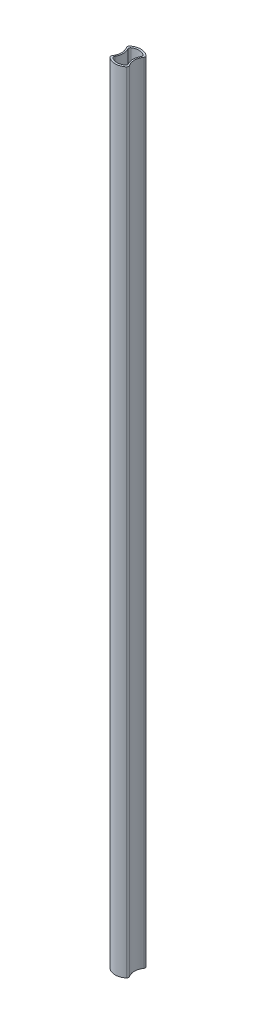
ISO-10303-21;
HEADER;
FILE_DESCRIPTION(('STEP AP214'),'2;1');
FILE_NAME('part.step','',(''),(''),'','','');
FILE_SCHEMA(('AUTOMOTIVE_DESIGN { 1 0 10303 214 1 1 1 1 }'));
ENDSEC;
DATA;
#1=APPLICATION_CONTEXT('core data for automotive mechanical design processes');
#2=APPLICATION_PROTOCOL_DEFINITION('international standard','automotive_design',2000,#1);
#3=PRODUCT_CONTEXT('',#1,'mechanical');
#4=PRODUCT('Part','Part','',(#3));
#5=PRODUCT_RELATED_PRODUCT_CATEGORY('part','',(#4));
#6=PRODUCT_DEFINITION_FORMATION('','',#4);
#7=PRODUCT_DEFINITION_CONTEXT('part definition',#1,'design');
#8=PRODUCT_DEFINITION('design','',#6,#7);
#9=PRODUCT_DEFINITION_SHAPE('','',#8);
#10=(LENGTH_UNIT() NAMED_UNIT(*) SI_UNIT(.MILLI.,.METRE.));
#11=(NAMED_UNIT(*) PLANE_ANGLE_UNIT() SI_UNIT($,.RADIAN.));
#12=(NAMED_UNIT(*) SI_UNIT($,.STERADIAN.) SOLID_ANGLE_UNIT());
#13=UNCERTAINTY_MEASURE_WITH_UNIT(LENGTH_MEASURE(1.E-05),#10,'distance_accuracy_value','');
#14=(GEOMETRIC_REPRESENTATION_CONTEXT(3) GLOBAL_UNCERTAINTY_ASSIGNED_CONTEXT((#13)) GLOBAL_UNIT_ASSIGNED_CONTEXT((#10,
#11,#12)) REPRESENTATION_CONTEXT('',''));
#15=CARTESIAN_POINT('',(0.,0.,0.));
#16=DIRECTION('',(0.,0.,1.));
#17=DIRECTION('',(1.,0.,0.));
#18=AXIS2_PLACEMENT_3D('',#15,#16,#17);
#19=CARTESIAN_POINT('',(-6.64583333333331,400.,2.10396038592809));
#20=DIRECTION('',(0.,-1.,0.));
#21=DIRECTION('',(0.,0.,-1.));
#22=AXIS2_PLACEMENT_3D('',#19,#20,#21);
#23=PLANE('',#22);
#24=CARTESIAN_POINT('',(-3.5416666666666,400.,4.20792077185641));
#25=DIRECTION('',(0.,1.,0.));
#26=DIRECTION('',(0.,0.,-1.));
#27=AXIS2_PLACEMENT_3D('',#24,#25,#26);
#28=CIRCLE('',#27,1.);
#29=CARTESIAN_POINT('',(-4.36944444444442,400.,3.64686466894221));
#30=VERTEX_POINT('',#29);
#31=CARTESIAN_POINT('',(-4.18560606060607,400.,4.97299727583033));
#32=VERTEX_POINT('',#31);
#33=EDGE_CURVE('E224',#30,#32,#28,.T.);
#34=ORIENTED_EDGE('',*,*,#33,.T.);
#35=CARTESIAN_POINT('',(0.,400.,-1.97758476261356E-13));
#36=DIRECTION('',(0.,1.,0.));
#37=DIRECTION('',(0.,0.,1.));
#38=AXIS2_PLACEMENT_3D('',#35,#36,#37);
#39=CIRCLE('',#38,6.5);
#40=CARTESIAN_POINT('',(4.18560606060611,400.,4.97299727583037));
#41=VERTEX_POINT('',#40);
#42=EDGE_CURVE('E227',#32,#41,#39,.T.);
#43=ORIENTED_EDGE('',*,*,#42,.T.);
#44=CARTESIAN_POINT('',(3.54166666666667,400.,4.20792077185641));
#45=DIRECTION('',(0.,1.,0.));
#46=DIRECTION('',(0.,0.,-1.));
#47=AXIS2_PLACEMENT_3D('',#44,#45,#46);
#48=CIRCLE('',#47,1.);
#49=CARTESIAN_POINT('',(4.36944444444448,400.,3.6468646689422));
#50=VERTEX_POINT('',#49);
#51=EDGE_CURVE('E230',#41,#50,#48,.T.);
#52=ORIENTED_EDGE('',*,*,#51,.T.);
#53=CARTESIAN_POINT('',(9.75000000000006,400.,-2.32452945780892E-13));
#54=DIRECTION('',(0.,-1.,0.));
#55=DIRECTION('',(0.,0.,1.));
#56=AXIS2_PLACEMENT_3D('',#53,#54,#55);
#57=CIRCLE('',#56,6.5);
#58=CARTESIAN_POINT('',(4.36944444444447,400.,-3.64686466894257));
#59=VERTEX_POINT('',#58);
#60=EDGE_CURVE('E232',#50,#59,#57,.T.);
#61=ORIENTED_EDGE('',*,*,#60,.T.);
#62=CARTESIAN_POINT('',(3.54166666666667,400.,-4.20792077185679));
#63=DIRECTION('',(0.,1.,0.));
#64=DIRECTION('',(0.,0.,1.));
#65=AXIS2_PLACEMENT_3D('',#62,#63,#64);
#66=CIRCLE('',#65,1.);
#67=CARTESIAN_POINT('',(4.18560606060608,400.,-4.9729972758307));
#68=VERTEX_POINT('',#67);
#69=EDGE_CURVE('E234',#59,#68,#66,.T.);
#70=ORIENTED_EDGE('',*,*,#69,.T.);
#71=CARTESIAN_POINT('',(0.,400.,-1.97758476261356E-13));
#72=DIRECTION('',(0.,1.,0.));
#73=DIRECTION('',(0.,0.,1.));
#74=AXIS2_PLACEMENT_3D('',#71,#72,#73);
#75=CIRCLE('',#74,6.5);
#76=CARTESIAN_POINT('',(-4.18560606060604,400.,-4.97299727583073));
#77=VERTEX_POINT('',#76);
#78=EDGE_CURVE('E236',#68,#77,#75,.T.);
#79=ORIENTED_EDGE('',*,*,#78,.T.);
#80=CARTESIAN_POINT('',(-3.54166666666664,400.,-4.20792077185677));
#81=DIRECTION('',(0.,1.,0.));
#82=DIRECTION('',(0.,0.,1.));
#83=AXIS2_PLACEMENT_3D('',#80,#81,#82);
#84=CIRCLE('',#83,1.);
#85=CARTESIAN_POINT('',(-4.36944444444442,400.,-3.64686466894259));
#86=VERTEX_POINT('',#85);
#87=EDGE_CURVE('E238',#77,#86,#84,.T.);
#88=ORIENTED_EDGE('',*,*,#87,.T.);
#89=CARTESIAN_POINT('',(-9.74999999999992,400.,-2.22044604925031E-13));
#90=DIRECTION('',(0.,-1.,0.));
#91=DIRECTION('',(0.,0.,1.));
#92=AXIS2_PLACEMENT_3D('',#89,#90,#91);
#93=CIRCLE('',#92,6.5);
#94=EDGE_CURVE('E240',#86,#30,#93,.T.);
#95=ORIENTED_EDGE('',*,*,#94,.T.);
#96=EDGE_LOOP('',(#34,#43,#52,#61,#70,#79,#88,#95));
#97=FACE_BOUND('',#96,.T.);
#98=CARTESIAN_POINT('',(-2.49999999999996,400.,-3.74165738677411));
#99=DIRECTION('',(0.,1.,0.));
#100=DIRECTION('',(0.,0.,-1.));
#101=AXIS2_PLACEMENT_3D('',#98,#99,#100);
#102=CIRCLE('',#101,1.);
#103=CARTESIAN_POINT('',(-3.05555555555555,400.,-4.57313680605723));
#104=VERTEX_POINT('',#103);
#105=CARTESIAN_POINT('',(-3.36666666666662,400.,-3.24276973520428));
#106=VERTEX_POINT('',#105);
#107=EDGE_CURVE('E159',#104,#106,#102,.T.);
#108=ORIENTED_EDGE('',*,*,#107,.F.);
#109=CARTESIAN_POINT('',(0.,400.,-1.97758476261356E-13));
#110=DIRECTION('',(0.,1.,0.));
#111=DIRECTION('',(0.,0.,1.));
#112=AXIS2_PLACEMENT_3D('',#109,#110,#111);
#113=CIRCLE('',#112,5.5);
#114=CARTESIAN_POINT('',(3.05555555555558,400.,-4.57313680605722));
#115=VERTEX_POINT('',#114);
#116=EDGE_CURVE('E192',#115,#104,#113,.T.);
#117=ORIENTED_EDGE('',*,*,#116,.F.);
#118=CARTESIAN_POINT('',(2.50000000000006,400.,-3.74165738677418));
#119=DIRECTION('',(0.,1.,0.));
#120=DIRECTION('',(0.,0.,-1.));
#121=AXIS2_PLACEMENT_3D('',#118,#119,#120);
#122=CIRCLE('',#121,1.);
#123=CARTESIAN_POINT('',(3.36666666666668,400.000000000001,-3.24276973520425));
#124=VERTEX_POINT('',#123);
#125=EDGE_CURVE('E190',#124,#115,#122,.T.);
#126=ORIENTED_EDGE('',*,*,#125,.F.);
#127=CARTESIAN_POINT('',(9.00000000000005,400.,-1.73472347597681E-13));
#128=DIRECTION('',(0.,-1.,0.));
#129=DIRECTION('',(0.,0.,1.));
#130=AXIS2_PLACEMENT_3D('',#127,#128,#129);
#131=CIRCLE('',#130,6.5);
#132=CARTESIAN_POINT('',(3.36666666666675,400.,3.24276973520387));
#133=VERTEX_POINT('',#132);
#134=EDGE_CURVE('E188',#133,#124,#131,.T.);
#135=ORIENTED_EDGE('',*,*,#134,.F.);
#136=CARTESIAN_POINT('',(2.50000000000002,400.,3.74165738677378));
#137=DIRECTION('',(0.,1.,0.));
#138=DIRECTION('',(0.,0.,-1.));
#139=AXIS2_PLACEMENT_3D('',#136,#137,#138);
#140=CIRCLE('',#139,1.);
#141=CARTESIAN_POINT('',(3.05555555555559,400.,4.57313680605683));
#142=VERTEX_POINT('',#141);
#143=EDGE_CURVE('E186',#142,#133,#140,.T.);
#144=ORIENTED_EDGE('',*,*,#143,.F.);
#145=CARTESIAN_POINT('',(0.,400.,-1.97758476261356E-13));
#146=DIRECTION('',(0.,1.,0.));
#147=DIRECTION('',(0.,0.,1.));
#148=AXIS2_PLACEMENT_3D('',#145,#146,#147);
#149=CIRCLE('',#148,5.5);
#150=CARTESIAN_POINT('',(-3.05555555555553,400.,4.57313680605684));
#151=VERTEX_POINT('',#150);
#152=EDGE_CURVE('E182',#151,#142,#149,.T.);
#153=ORIENTED_EDGE('',*,*,#152,.F.);
#154=CARTESIAN_POINT('',(-2.49999999999999,400.,3.74165738677376));
#155=DIRECTION('',(0.,1.,0.));
#156=DIRECTION('',(0.,0.,1.));
#157=AXIS2_PLACEMENT_3D('',#154,#155,#156);
#158=CIRCLE('',#157,1.);
#159=CARTESIAN_POINT('',(-3.3666666666666,400.,3.24276973520386));
#160=VERTEX_POINT('',#159);
#161=EDGE_CURVE('E180',#160,#151,#158,.T.);
#162=ORIENTED_EDGE('',*,*,#161,.F.);
#163=CARTESIAN_POINT('',(-8.99999999999993,400.,-1.94289029309402E-13));
#164=DIRECTION('',(0.,-1.,0.));
#165=DIRECTION('',(0.,0.,1.));
#166=AXIS2_PLACEMENT_3D('',#163,#164,#165);
#167=CIRCLE('',#166,6.5);
#168=EDGE_CURVE('E167',#106,#160,#167,.T.);
#169=ORIENTED_EDGE('',*,*,#168,.F.);
#170=EDGE_LOOP('',(#108,#117,#126,#135,#144,#153,#162,#169));
#171=FACE_BOUND('',#170,.T.);
#172=ADVANCED_FACE('F46',(#97,#171),#23,.F.);
#173=CARTESIAN_POINT('',(-6.64583333333334,3.33066907387547E-13,2.10396038592828));
#174=DIRECTION('',(0.,-1.,0.));
#175=DIRECTION('',(0.,0.,-1.));
#176=AXIS2_PLACEMENT_3D('',#173,#174,#175);
#177=PLANE('',#176);
#178=CARTESIAN_POINT('',(-3.54166666666673,1.11022302462516E-13,4.20792077185658));
#179=DIRECTION('',(0.,1.,0.));
#180=DIRECTION('',(0.,0.,-1.));
#181=AXIS2_PLACEMENT_3D('',#178,#179,#180);
#182=CIRCLE('',#181,1.);
#183=CARTESIAN_POINT('',(-4.36944444444444,5.55111512312578E-13,3.64686466894239));
#184=VERTEX_POINT('',#183);
#185=CARTESIAN_POINT('',(-4.18560606060608,1.11022302462516E-13,4.9729972758305));
#186=VERTEX_POINT('',#185);
#187=EDGE_CURVE('E175',#184,#186,#182,.T.);
#188=ORIENTED_EDGE('',*,*,#187,.F.);
#189=CARTESIAN_POINT('',(-9.75000000000007,1.11022302462516E-13,0.));
#190=DIRECTION('',(0.,-1.,0.));
#191=DIRECTION('',(0.,0.,1.));
#192=AXIS2_PLACEMENT_3D('',#189,#190,#191);
#193=CIRCLE('',#192,6.5);
#194=CARTESIAN_POINT('',(-4.3694444444445,2.22044604925031E-13,-3.64686466894243));
#195=VERTEX_POINT('',#194);
#196=EDGE_CURVE('E228',#195,#184,#193,.T.);
#197=ORIENTED_EDGE('',*,*,#196,.F.);
#198=CARTESIAN_POINT('',(-3.54166666666669,3.33066907387547E-13,-4.2079207718566));
#199=DIRECTION('',(0.,1.,0.));
#200=DIRECTION('',(0.,0.,1.));
#201=AXIS2_PLACEMENT_3D('',#198,#199,#200);
#202=CIRCLE('',#201,1.);
#203=CARTESIAN_POINT('',(-4.1856060606061,-1.11022302462516E-13,-4.97299727583057));
#204=VERTEX_POINT('',#203);
#205=EDGE_CURVE('E255',#204,#195,#202,.T.);
#206=ORIENTED_EDGE('',*,*,#205,.F.);
#207=CARTESIAN_POINT('',(0.,0.,0.));
#208=DIRECTION('',(0.,1.,0.));
#209=DIRECTION('',(0.,0.,1.));
#210=AXIS2_PLACEMENT_3D('',#207,#208,#209);
#211=CIRCLE('',#210,6.5);
#212=CARTESIAN_POINT('',(4.18560606060603,2.22044604925031E-13,-4.97299727583055));
#213=VERTEX_POINT('',#212);
#214=EDGE_CURVE('E253',#213,#204,#211,.T.);
#215=ORIENTED_EDGE('',*,*,#214,.F.);
#216=CARTESIAN_POINT('',(3.54166666666664,3.33066907387547E-13,-4.20792077185661));
#217=DIRECTION('',(0.,1.,0.));
#218=DIRECTION('',(0.,0.,1.));
#219=AXIS2_PLACEMENT_3D('',#216,#217,#218);
#220=CIRCLE('',#219,1.);
#221=CARTESIAN_POINT('',(4.36944444444443,3.33066907387547E-13,-3.64686466894237));
#222=VERTEX_POINT('',#221);
#223=EDGE_CURVE('E251',#222,#213,#220,.T.);
#224=ORIENTED_EDGE('',*,*,#223,.F.);
#225=CARTESIAN_POINT('',(9.75000000000002,0.,0.));
#226=DIRECTION('',(0.,-1.,0.));
#227=DIRECTION('',(0.,0.,1.));
#228=AXIS2_PLACEMENT_3D('',#225,#226,#227);
#229=CIRCLE('',#228,6.5);
#230=CARTESIAN_POINT('',(4.36944444444445,2.22044604925031E-13,3.64686466894233));
#231=VERTEX_POINT('',#230);
#232=EDGE_CURVE('E249',#231,#222,#229,.T.);
#233=ORIENTED_EDGE('',*,*,#232,.F.);
#234=CARTESIAN_POINT('',(3.54166666666666,1.11022302462516E-13,4.20792077185658));
#235=DIRECTION('',(0.,1.,0.));
#236=DIRECTION('',(0.,0.,-1.));
#237=AXIS2_PLACEMENT_3D('',#234,#235,#236);
#238=CIRCLE('',#237,1.);
#239=CARTESIAN_POINT('',(4.18560606060605,1.11022302462516E-13,4.97299727583053));
#240=VERTEX_POINT('',#239);
#241=EDGE_CURVE('E247',#240,#231,#238,.T.);
#242=ORIENTED_EDGE('',*,*,#241,.F.);
#243=CARTESIAN_POINT('',(0.,0.,0.));
#244=DIRECTION('',(0.,1.,0.));
#245=DIRECTION('',(0.,0.,1.));
#246=AXIS2_PLACEMENT_3D('',#243,#244,#245);
#247=CIRCLE('',#246,6.5);
#248=EDGE_CURVE('E245',#186,#240,#247,.T.);
#249=ORIENTED_EDGE('',*,*,#248,.F.);
#250=EDGE_LOOP('',(#188,#197,#206,#215,#224,#233,#242,#249));
#251=FACE_BOUND('',#250,.T.);
#252=CARTESIAN_POINT('',(0.,0.,0.));
#253=DIRECTION('',(0.,1.,0.));
#254=DIRECTION('',(0.,0.,1.));
#255=AXIS2_PLACEMENT_3D('',#252,#253,#254);
#256=CIRCLE('',#255,5.5);
#257=CARTESIAN_POINT('',(3.05555555555552,-1.11022302462516E-13,-4.57313680605707));
#258=VERTEX_POINT('',#257);
#259=CARTESIAN_POINT('',(-3.05555555555554,0.,-4.57313680605707));
#260=VERTEX_POINT('',#259);
#261=EDGE_CURVE('E168',#258,#260,#256,.T.);
#262=ORIENTED_EDGE('',*,*,#261,.T.);
#263=CARTESIAN_POINT('',(-2.50000000000002,4.44089209850063E-13,-3.74165738677393));
#264=DIRECTION('',(0.,1.,0.));
#265=DIRECTION('',(0.,0.,-1.));
#266=AXIS2_PLACEMENT_3D('',#263,#264,#265);
#267=CIRCLE('',#266,1.);
#268=CARTESIAN_POINT('',(-3.36666666666671,2.22044604925031E-13,-3.2427697352041));
#269=VERTEX_POINT('',#268);
#270=EDGE_CURVE('E69',#260,#269,#267,.T.);
#271=ORIENTED_EDGE('',*,*,#270,.T.);
#272=CARTESIAN_POINT('',(-9.00000000000008,0.,0.));
#273=DIRECTION('',(0.,-1.,0.));
#274=DIRECTION('',(0.,0.,1.));
#275=AXIS2_PLACEMENT_3D('',#272,#273,#274);
#276=CIRCLE('',#275,6.5);
#277=CARTESIAN_POINT('',(-3.36666666666668,4.44089209850063E-13,3.24276973520407));
#278=VERTEX_POINT('',#277);
#279=EDGE_CURVE('E174',#269,#278,#276,.T.);
#280=ORIENTED_EDGE('',*,*,#279,.T.);
#281=CARTESIAN_POINT('',(-2.50000000000004,3.33066907387547E-13,3.74165738677393));
#282=DIRECTION('',(0.,1.,0.));
#283=DIRECTION('',(0.,0.,1.));
#284=AXIS2_PLACEMENT_3D('',#281,#282,#283);
#285=CIRCLE('',#284,1.);
#286=CARTESIAN_POINT('',(-3.05555555555563,1.11022302462516E-13,4.57313680605702));
#287=VERTEX_POINT('',#286);
#288=EDGE_CURVE('E196',#278,#287,#285,.T.);
#289=ORIENTED_EDGE('',*,*,#288,.T.);
#290=CARTESIAN_POINT('',(0.,0.,0.));
#291=DIRECTION('',(0.,1.,0.));
#292=DIRECTION('',(0.,0.,1.));
#293=AXIS2_PLACEMENT_3D('',#290,#291,#292);
#294=CIRCLE('',#293,5.5);
#295=CARTESIAN_POINT('',(3.05555555555554,0.,4.57313680605703));
#296=VERTEX_POINT('',#295);
#297=EDGE_CURVE('E199',#287,#296,#294,.T.);
#298=ORIENTED_EDGE('',*,*,#297,.T.);
#299=CARTESIAN_POINT('',(2.49999999999996,1.11022302462516E-13,3.74165738677391));
#300=DIRECTION('',(0.,1.,0.));
#301=DIRECTION('',(0.,0.,-1.));
#302=AXIS2_PLACEMENT_3D('',#299,#300,#301);
#303=CIRCLE('',#302,1.);
#304=CARTESIAN_POINT('',(3.3666666666666,0.,3.24276973520405));
#305=VERTEX_POINT('',#304);
#306=EDGE_CURVE('E202',#296,#305,#303,.T.);
#307=ORIENTED_EDGE('',*,*,#306,.T.);
#308=CARTESIAN_POINT('',(8.99999999999996,3.33066907387547E-13,0.));
#309=DIRECTION('',(0.,-1.,0.));
#310=DIRECTION('',(0.,0.,1.));
#311=AXIS2_PLACEMENT_3D('',#308,#309,#310);
#312=CIRCLE('',#311,6.5);
#313=CARTESIAN_POINT('',(3.36666666666661,-1.11022302462516E-13,-3.24276973520414));
#314=VERTEX_POINT('',#313);
#315=EDGE_CURVE('E205',#305,#314,#312,.T.);
#316=ORIENTED_EDGE('',*,*,#315,.T.);
#317=CARTESIAN_POINT('',(2.5,1.11022302462516E-13,-3.74165738677398));
#318=DIRECTION('',(0.,1.,0.));
#319=DIRECTION('',(0.,0.,-1.));
#320=AXIS2_PLACEMENT_3D('',#317,#318,#319);
#321=CIRCLE('',#320,1.);
#322=EDGE_CURVE('E208',#314,#258,#321,.T.);
#323=ORIENTED_EDGE('',*,*,#322,.T.);
#324=EDGE_LOOP('',(#262,#271,#280,#289,#298,#307,#316,#323));
#325=FACE_BOUND('',#324,.T.);
#326=ADVANCED_FACE('F285',(#251,#325),#177,.T.);
#327=CARTESIAN_POINT('',(-3.5416666666666,400.,4.20792077185641));
#328=DIRECTION('',(0.,-1.,0.));
#329=DIRECTION('',(0.,0.,-1.));
#330=AXIS2_PLACEMENT_3D('',#327,#328,#329);
#331=CYLINDRICAL_SURFACE('',#330,1.);
#332=ORIENTED_EDGE('',*,*,#187,.T.);
#333=DIRECTION('',(0.,-1.,0.));
#334=VECTOR('',#333,1.);
#335=CARTESIAN_POINT('',(-4.18560606060607,400.,4.97299727583033));
#336=LINE('',#335,#334);
#337=EDGE_CURVE('E13',#32,#186,#336,.T.);
#338=ORIENTED_EDGE('',*,*,#337,.F.);
#339=ORIENTED_EDGE('',*,*,#33,.F.);
#340=DIRECTION('',(0.,-1.,0.));
#341=VECTOR('',#340,1.);
#342=CARTESIAN_POINT('',(-4.36944444444442,400.,3.64686466894221));
#343=LINE('',#342,#341);
#344=EDGE_CURVE('E242',#30,#184,#343,.T.);
#345=ORIENTED_EDGE('',*,*,#344,.T.);
#346=EDGE_LOOP('',(#332,#338,#339,#345));
#347=FACE_BOUND('',#346,.T.);
#348=ADVANCED_FACE('F48',(#347),#331,.T.);
#349=CARTESIAN_POINT('',(0.,400.,-1.97758476261356E-13));
#350=DIRECTION('',(0.,-1.,0.));
#351=DIRECTION('',(0.,0.,-1.));
#352=AXIS2_PLACEMENT_3D('',#349,#350,#351);
#353=CYLINDRICAL_SURFACE('',#352,6.5);
#354=ORIENTED_EDGE('',*,*,#248,.T.);
#355=DIRECTION('',(0.,-1.,0.));
#356=VECTOR('',#355,1.);
#357=CARTESIAN_POINT('',(4.18560606060611,400.,4.97299727583037));
#358=LINE('',#357,#356);
#359=EDGE_CURVE('E54',#41,#240,#358,.T.);
#360=ORIENTED_EDGE('',*,*,#359,.F.);
#361=ORIENTED_EDGE('',*,*,#42,.F.);
#362=ORIENTED_EDGE('',*,*,#337,.T.);
#363=EDGE_LOOP('',(#354,#360,#361,#362));
#364=FACE_BOUND('',#363,.T.);
#365=ADVANCED_FACE('F302',(#364),#353,.T.);
#366=CARTESIAN_POINT('',(3.54166666666667,400.,4.20792077185641));
#367=DIRECTION('',(0.,-1.,0.));
#368=DIRECTION('',(0.,0.,-1.));
#369=AXIS2_PLACEMENT_3D('',#366,#367,#368);
#370=CYLINDRICAL_SURFACE('',#369,1.);
#371=ORIENTED_EDGE('',*,*,#241,.T.);
#372=DIRECTION('',(0.,-1.,0.));
#373=VECTOR('',#372,1.);
#374=CARTESIAN_POINT('',(4.36944444444448,400.,3.6468646689422));
#375=LINE('',#374,#373);
#376=EDGE_CURVE('E272',#50,#231,#375,.T.);
#377=ORIENTED_EDGE('',*,*,#376,.F.);
#378=ORIENTED_EDGE('',*,*,#51,.F.);
#379=ORIENTED_EDGE('',*,*,#359,.T.);
#380=EDGE_LOOP('',(#371,#377,#378,#379));
#381=FACE_BOUND('',#380,.T.);
#382=ADVANCED_FACE('F279',(#381),#370,.T.);
#383=CARTESIAN_POINT('',(9.75000000000006,400.,-2.32452945780892E-13));
#384=DIRECTION('',(0.,-1.,0.));
#385=DIRECTION('',(0.,0.,-1.));
#386=AXIS2_PLACEMENT_3D('',#383,#384,#385);
#387=CYLINDRICAL_SURFACE('',#386,6.5);
#388=ORIENTED_EDGE('',*,*,#232,.T.);
#389=DIRECTION('',(0.,-1.,0.));
#390=VECTOR('',#389,1.);
#391=CARTESIAN_POINT('',(4.36944444444447,400.,-3.64686466894257));
#392=LINE('',#391,#390);
#393=EDGE_CURVE('E269',#59,#222,#392,.T.);
#394=ORIENTED_EDGE('',*,*,#393,.F.);
#395=ORIENTED_EDGE('',*,*,#60,.F.);
#396=ORIENTED_EDGE('',*,*,#376,.T.);
#397=EDGE_LOOP('',(#388,#394,#395,#396));
#398=FACE_BOUND('',#397,.T.);
#399=ADVANCED_FACE('F291',(#398),#387,.F.);
#400=CARTESIAN_POINT('',(3.54166666666667,400.,-4.20792077185679));
#401=DIRECTION('',(0.,-1.,0.));
#402=DIRECTION('',(0.,0.,-1.));
#403=AXIS2_PLACEMENT_3D('',#400,#401,#402);
#404=CYLINDRICAL_SURFACE('',#403,1.);
#405=ORIENTED_EDGE('',*,*,#223,.T.);
#406=DIRECTION('',(0.,-1.,0.));
#407=VECTOR('',#406,1.);
#408=CARTESIAN_POINT('',(4.18560606060608,400.,-4.9729972758307));
#409=LINE('',#408,#407);
#410=EDGE_CURVE('E266',#68,#213,#409,.T.);
#411=ORIENTED_EDGE('',*,*,#410,.F.);
#412=ORIENTED_EDGE('',*,*,#69,.F.);
#413=ORIENTED_EDGE('',*,*,#393,.T.);
#414=EDGE_LOOP('',(#405,#411,#412,#413));
#415=FACE_BOUND('',#414,.T.);
#416=ADVANCED_FACE('F295',(#415),#404,.T.);
#417=CARTESIAN_POINT('',(0.,400.,-1.97758476261356E-13));
#418=DIRECTION('',(0.,-1.,0.));
#419=DIRECTION('',(0.,0.,-1.));
#420=AXIS2_PLACEMENT_3D('',#417,#418,#419);
#421=CYLINDRICAL_SURFACE('',#420,6.5);
#422=ORIENTED_EDGE('',*,*,#214,.T.);
#423=DIRECTION('',(0.,-1.,0.));
#424=VECTOR('',#423,1.);
#425=CARTESIAN_POINT('',(-4.18560606060604,400.,-4.97299727583073));
#426=LINE('',#425,#424);
#427=EDGE_CURVE('E263',#77,#204,#426,.T.);
#428=ORIENTED_EDGE('',*,*,#427,.F.);
#429=ORIENTED_EDGE('',*,*,#78,.F.);
#430=ORIENTED_EDGE('',*,*,#410,.T.);
#431=EDGE_LOOP('',(#422,#428,#429,#430));
#432=FACE_BOUND('',#431,.T.);
#433=ADVANCED_FACE('F315',(#432),#421,.T.);
#434=CARTESIAN_POINT('',(-3.54166666666664,400.,-4.20792077185677));
#435=DIRECTION('',(0.,-1.,0.));
#436=DIRECTION('',(0.,0.,-1.));
#437=AXIS2_PLACEMENT_3D('',#434,#435,#436);
#438=CYLINDRICAL_SURFACE('',#437,1.);
#439=ORIENTED_EDGE('',*,*,#205,.T.);
#440=DIRECTION('',(0.,-1.,0.));
#441=VECTOR('',#440,1.);
#442=CARTESIAN_POINT('',(-4.36944444444442,400.,-3.64686466894259));
#443=LINE('',#442,#441);
#444=EDGE_CURVE('E260',#86,#195,#443,.T.);
#445=ORIENTED_EDGE('',*,*,#444,.F.);
#446=ORIENTED_EDGE('',*,*,#87,.F.);
#447=ORIENTED_EDGE('',*,*,#427,.T.);
#448=EDGE_LOOP('',(#439,#445,#446,#447));
#449=FACE_BOUND('',#448,.T.);
#450=ADVANCED_FACE('F313',(#449),#438,.T.);
#451=CARTESIAN_POINT('',(-9.74999999999992,400.,-2.22044604925031E-13));
#452=DIRECTION('',(0.,-1.,0.));
#453=DIRECTION('',(0.,0.,-1.));
#454=AXIS2_PLACEMENT_3D('',#451,#452,#453);
#455=CYLINDRICAL_SURFACE('',#454,6.5);
#456=ORIENTED_EDGE('',*,*,#196,.T.);
#457=ORIENTED_EDGE('',*,*,#344,.F.);
#458=ORIENTED_EDGE('',*,*,#94,.F.);
#459=ORIENTED_EDGE('',*,*,#444,.T.);
#460=EDGE_LOOP('',(#456,#457,#458,#459));
#461=FACE_BOUND('',#460,.T.);
#462=ADVANCED_FACE('F308',(#461),#455,.F.);
#463=CARTESIAN_POINT('',(-2.49999999999996,400.,-3.74165738677411));
#464=DIRECTION('',(0.,-1.,0.));
#465=DIRECTION('',(0.,0.,-1.));
#466=AXIS2_PLACEMENT_3D('',#463,#464,#465);
#467=CYLINDRICAL_SURFACE('',#466,1.);
#468=ORIENTED_EDGE('',*,*,#270,.F.);
#469=DIRECTION('',(0.,-1.,0.));
#470=VECTOR('',#469,1.);
#471=CARTESIAN_POINT('',(-3.05555555555555,400.,-4.57313680605723));
#472=LINE('',#471,#470);
#473=EDGE_CURVE('E163',#104,#260,#472,.T.);
#474=ORIENTED_EDGE('',*,*,#473,.F.);
#475=ORIENTED_EDGE('',*,*,#107,.T.);
#476=DIRECTION('',(0.,-1.,0.));
#477=VECTOR('',#476,1.);
#478=CARTESIAN_POINT('',(-3.36666666666662,400.,-3.24276973520428));
#479=LINE('',#478,#477);
#480=EDGE_CURVE('E162',#106,#269,#479,.T.);
#481=ORIENTED_EDGE('',*,*,#480,.T.);
#482=EDGE_LOOP('',(#468,#474,#475,#481));
#483=FACE_BOUND('',#482,.T.);
#484=ADVANCED_FACE('F161',(#483),#467,.F.);
#485=CARTESIAN_POINT('',(-8.99999999999993,400.,-1.94289029309402E-13));
#486=DIRECTION('',(0.,-1.,0.));
#487=DIRECTION('',(0.,0.,-1.));
#488=AXIS2_PLACEMENT_3D('',#485,#486,#487);
#489=CYLINDRICAL_SURFACE('',#488,6.5);
#490=ORIENTED_EDGE('',*,*,#279,.F.);
#491=ORIENTED_EDGE('',*,*,#480,.F.);
#492=ORIENTED_EDGE('',*,*,#168,.T.);
#493=DIRECTION('',(0.,-1.,0.));
#494=VECTOR('',#493,1.);
#495=CARTESIAN_POINT('',(-3.3666666666666,400.,3.24276973520386));
#496=LINE('',#495,#494);
#497=EDGE_CURVE('E176',#160,#278,#496,.T.);
#498=ORIENTED_EDGE('',*,*,#497,.T.);
#499=EDGE_LOOP('',(#490,#491,#492,#498));
#500=FACE_BOUND('',#499,.T.);
#501=ADVANCED_FACE('F171',(#500),#489,.T.);
#502=CARTESIAN_POINT('',(-2.49999999999999,400.,3.74165738677376));
#503=DIRECTION('',(0.,-1.,0.));
#504=DIRECTION('',(0.,0.,-1.));
#505=AXIS2_PLACEMENT_3D('',#502,#503,#504);
#506=CYLINDRICAL_SURFACE('',#505,1.);
#507=ORIENTED_EDGE('',*,*,#288,.F.);
#508=ORIENTED_EDGE('',*,*,#497,.F.);
#509=ORIENTED_EDGE('',*,*,#161,.T.);
#510=DIRECTION('',(0.,-1.,0.));
#511=VECTOR('',#510,1.);
#512=CARTESIAN_POINT('',(-3.05555555555553,400.,4.57313680605684));
#513=LINE('',#512,#511);
#514=EDGE_CURVE('E221',#151,#287,#513,.T.);
#515=ORIENTED_EDGE('',*,*,#514,.T.);
#516=EDGE_LOOP('',(#507,#508,#509,#515));
#517=FACE_BOUND('',#516,.T.);
#518=ADVANCED_FACE('F340',(#517),#506,.F.);
#519=CARTESIAN_POINT('',(0.,400.,-1.97758476261356E-13));
#520=DIRECTION('',(0.,-1.,0.));
#521=DIRECTION('',(0.,0.,-1.));
#522=AXIS2_PLACEMENT_3D('',#519,#520,#521);
#523=CYLINDRICAL_SURFACE('',#522,5.5);
#524=ORIENTED_EDGE('',*,*,#297,.F.);
#525=ORIENTED_EDGE('',*,*,#514,.F.);
#526=ORIENTED_EDGE('',*,*,#152,.T.);
#527=DIRECTION('',(0.,-1.,0.));
#528=VECTOR('',#527,1.);
#529=CARTESIAN_POINT('',(3.05555555555559,400.,4.57313680605683));
#530=LINE('',#529,#528);
#531=EDGE_CURVE('E219',#142,#296,#530,.T.);
#532=ORIENTED_EDGE('',*,*,#531,.T.);
#533=EDGE_LOOP('',(#524,#525,#526,#532));
#534=FACE_BOUND('',#533,.T.);
#535=ADVANCED_FACE('F344',(#534),#523,.F.);
#536=CARTESIAN_POINT('',(2.50000000000002,400.,3.74165738677378));
#537=DIRECTION('',(0.,-1.,0.));
#538=DIRECTION('',(0.,0.,-1.));
#539=AXIS2_PLACEMENT_3D('',#536,#537,#538);
#540=CYLINDRICAL_SURFACE('',#539,1.);
#541=ORIENTED_EDGE('',*,*,#306,.F.);
#542=ORIENTED_EDGE('',*,*,#531,.F.);
#543=ORIENTED_EDGE('',*,*,#143,.T.);
#544=DIRECTION('',(0.,-1.,0.));
#545=VECTOR('',#544,1.);
#546=CARTESIAN_POINT('',(3.36666666666675,400.,3.24276973520387));
#547=LINE('',#546,#545);
#548=EDGE_CURVE('E217',#133,#305,#547,.T.);
#549=ORIENTED_EDGE('',*,*,#548,.T.);
#550=EDGE_LOOP('',(#541,#542,#543,#549));
#551=FACE_BOUND('',#550,.T.);
#552=ADVANCED_FACE('F350',(#551),#540,.F.);
#553=CARTESIAN_POINT('',(9.00000000000005,400.,-1.73472347597681E-13));
#554=DIRECTION('',(0.,-1.,0.));
#555=DIRECTION('',(0.,0.,-1.));
#556=AXIS2_PLACEMENT_3D('',#553,#554,#555);
#557=CYLINDRICAL_SURFACE('',#556,6.5);
#558=ORIENTED_EDGE('',*,*,#315,.F.);
#559=ORIENTED_EDGE('',*,*,#548,.F.);
#560=ORIENTED_EDGE('',*,*,#134,.T.);
#561=DIRECTION('',(0.,-1.,0.));
#562=VECTOR('',#561,1.);
#563=CARTESIAN_POINT('',(3.36666666666668,400.000000000001,-3.24276973520425));
#564=LINE('',#563,#562);
#565=EDGE_CURVE('E215',#124,#314,#564,.T.);
#566=ORIENTED_EDGE('',*,*,#565,.T.);
#567=EDGE_LOOP('',(#558,#559,#560,#566));
#568=FACE_BOUND('',#567,.T.);
#569=ADVANCED_FACE('F354',(#568),#557,.T.);
#570=CARTESIAN_POINT('',(2.50000000000006,400.,-3.74165738677418));
#571=DIRECTION('',(0.,-1.,0.));
#572=DIRECTION('',(0.,0.,-1.));
#573=AXIS2_PLACEMENT_3D('',#570,#571,#572);
#574=CYLINDRICAL_SURFACE('',#573,1.);
#575=ORIENTED_EDGE('',*,*,#322,.F.);
#576=ORIENTED_EDGE('',*,*,#565,.F.);
#577=ORIENTED_EDGE('',*,*,#125,.T.);
#578=DIRECTION('',(0.,-1.,0.));
#579=VECTOR('',#578,1.);
#580=CARTESIAN_POINT('',(3.05555555555558,400.,-4.57313680605722));
#581=LINE('',#580,#579);
#582=EDGE_CURVE('E61',#115,#258,#581,.T.);
#583=ORIENTED_EDGE('',*,*,#582,.T.);
#584=EDGE_LOOP('',(#575,#576,#577,#583));
#585=FACE_BOUND('',#584,.T.);
#586=ADVANCED_FACE('F358',(#585),#574,.F.);
#587=CARTESIAN_POINT('',(0.,400.,-1.97758476261356E-13));
#588=DIRECTION('',(0.,-1.,0.));
#589=DIRECTION('',(0.,0.,-1.));
#590=AXIS2_PLACEMENT_3D('',#587,#588,#589);
#591=CYLINDRICAL_SURFACE('',#590,5.5);
#592=ORIENTED_EDGE('',*,*,#261,.F.);
#593=ORIENTED_EDGE('',*,*,#582,.F.);
#594=ORIENTED_EDGE('',*,*,#116,.T.);
#595=ORIENTED_EDGE('',*,*,#473,.T.);
#596=EDGE_LOOP('',(#592,#593,#594,#595));
#597=FACE_BOUND('',#596,.T.);
#598=ADVANCED_FACE('F362',(#597),#591,.F.);
#599=CLOSED_SHELL('',(#172,#326,#348,#365,#382,#399,#416,#433,#450,#462,#484,#501,#518,#535,
#552,#569,#586,#598));
#600=MANIFOLD_SOLID_BREP('B2',#599);
#601=ADVANCED_BREP_SHAPE_REPRESENTATION('',(#18,#600),#14);
#602=SHAPE_DEFINITION_REPRESENTATION(#9,#601);
ENDSEC;
END-ISO-10303-21;
